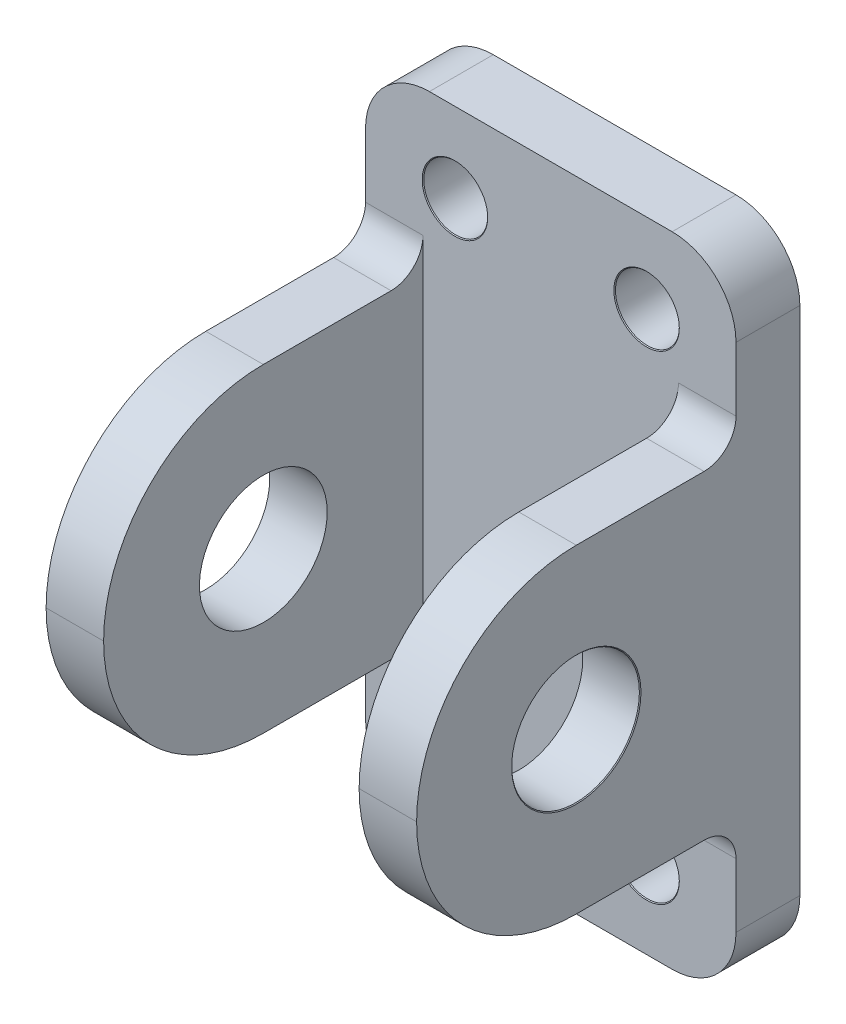
ISO-10303-21;
HEADER;
FILE_DESCRIPTION(('STEP AP214'),'2;1');
FILE_NAME('part.step','',(''),(''),'','','');
FILE_SCHEMA(('AUTOMOTIVE_DESIGN { 1 0 10303 214 1 1 1 1 }'));
ENDSEC;
DATA;
#1=APPLICATION_CONTEXT('core data for automotive mechanical design processes');
#2=APPLICATION_PROTOCOL_DEFINITION('international standard','automotive_design',2000,#1);
#3=PRODUCT_CONTEXT('',#1,'mechanical');
#4=PRODUCT('Part','Part','',(#3));
#5=PRODUCT_RELATED_PRODUCT_CATEGORY('part','',(#4));
#6=PRODUCT_DEFINITION_FORMATION('','',#4);
#7=PRODUCT_DEFINITION_CONTEXT('part definition',#1,'design');
#8=PRODUCT_DEFINITION('design','',#6,#7);
#9=PRODUCT_DEFINITION_SHAPE('','',#8);
#10=(LENGTH_UNIT() NAMED_UNIT(*) SI_UNIT(.MILLI.,.METRE.));
#11=(NAMED_UNIT(*) PLANE_ANGLE_UNIT() SI_UNIT($,.RADIAN.));
#12=(NAMED_UNIT(*) SI_UNIT($,.STERADIAN.) SOLID_ANGLE_UNIT());
#13=UNCERTAINTY_MEASURE_WITH_UNIT(LENGTH_MEASURE(1.E-05),#10,'distance_accuracy_value','');
#14=(GEOMETRIC_REPRESENTATION_CONTEXT(3) GLOBAL_UNCERTAINTY_ASSIGNED_CONTEXT((#13)) GLOBAL_UNIT_ASSIGNED_CONTEXT((#10,
#11,#12)) REPRESENTATION_CONTEXT('',''));
#15=CARTESIAN_POINT('',(0.,0.,0.));
#16=DIRECTION('',(0.,0.,1.));
#17=DIRECTION('',(1.,0.,0.));
#18=AXIS2_PLACEMENT_3D('',#15,#16,#17);
#19=CARTESIAN_POINT('',(0.,0.,0.));
#20=DIRECTION('',(0.,0.,1.));
#21=DIRECTION('',(1.,0.,0.));
#22=AXIS2_PLACEMENT_3D('',#19,#20,#21);
#23=PLANE('',#22);
#24=CARTESIAN_POINT('',(-3.,-7.5,0.));
#25=DIRECTION('',(0.,0.,1.));
#26=DIRECTION('',(1.,0.,0.));
#27=AXIS2_PLACEMENT_3D('',#24,#25,#26);
#28=CIRCLE('',#27,1.025);
#29=CARTESIAN_POINT('',(-1.975,-7.5,0.));
#30=VERTEX_POINT('',#29);
#31=EDGE_CURVE('E416',#30,#30,#28,.T.);
#32=ORIENTED_EDGE('',*,*,#31,.F.);
#33=EDGE_LOOP('',(#32));
#34=FACE_BOUND('',#33,.T.);
#35=CARTESIAN_POINT('',(3.,-7.5,0.));
#36=DIRECTION('',(0.,0.,1.));
#37=DIRECTION('',(1.,0.,0.));
#38=AXIS2_PLACEMENT_3D('',#35,#36,#37);
#39=CIRCLE('',#38,1.025);
#40=CARTESIAN_POINT('',(4.025,-7.5,0.));
#41=VERTEX_POINT('',#40);
#42=EDGE_CURVE('E406',#41,#41,#39,.T.);
#43=ORIENTED_EDGE('',*,*,#42,.F.);
#44=EDGE_LOOP('',(#43));
#45=FACE_BOUND('',#44,.T.);
#46=CARTESIAN_POINT('',(-3.,7.5,0.));
#47=DIRECTION('',(0.,0.,1.));
#48=DIRECTION('',(1.,0.,0.));
#49=AXIS2_PLACEMENT_3D('',#46,#47,#48);
#50=CIRCLE('',#49,1.025);
#51=CARTESIAN_POINT('',(-1.975,7.5,0.));
#52=VERTEX_POINT('',#51);
#53=EDGE_CURVE('E399',#52,#52,#50,.T.);
#54=ORIENTED_EDGE('',*,*,#53,.F.);
#55=EDGE_LOOP('',(#54));
#56=FACE_BOUND('',#55,.T.);
#57=CARTESIAN_POINT('',(3.,7.5,0.));
#58=DIRECTION('',(0.,0.,1.));
#59=DIRECTION('',(1.,0.,0.));
#60=AXIS2_PLACEMENT_3D('',#57,#58,#59);
#61=CIRCLE('',#60,1.025);
#62=CARTESIAN_POINT('',(4.025,7.5,0.));
#63=VERTEX_POINT('',#62);
#64=EDGE_CURVE('E388',#63,#63,#61,.T.);
#65=ORIENTED_EDGE('',*,*,#64,.F.);
#66=EDGE_LOOP('',(#65));
#67=FACE_BOUND('',#66,.T.);
#68=DIRECTION('',(0.,-1.,0.));
#69=VECTOR('',#68,1.);
#70=CARTESIAN_POINT('',(-5.8,-10.,0.));
#71=LINE('',#70,#69);
#72=CARTESIAN_POINT('',(-5.8,8.,0.));
#73=VERTEX_POINT('',#72);
#74=CARTESIAN_POINT('',(-5.8,6.,0.));
#75=VERTEX_POINT('',#74);
#76=EDGE_CURVE('E227',#73,#75,#71,.T.);
#77=ORIENTED_EDGE('',*,*,#76,.T.);
#78=DIRECTION('',(1.,0.,0.));
#79=VECTOR('',#78,1.);
#80=CARTESIAN_POINT('',(-4.,6.,0.));
#81=LINE('',#80,#79);
#82=CARTESIAN_POINT('',(-4.,6.,0.));
#83=VERTEX_POINT('',#82);
#84=EDGE_CURVE('E297',#75,#83,#81,.T.);
#85=ORIENTED_EDGE('',*,*,#84,.T.);
#86=DIRECTION('',(0.,1.,0.));
#87=VECTOR('',#86,1.);
#88=CARTESIAN_POINT('',(-4.,0.,0.));
#89=LINE('',#88,#87);
#90=CARTESIAN_POINT('',(-4.,-6.,0.));
#91=VERTEX_POINT('',#90);
#92=EDGE_CURVE('E328',#91,#83,#89,.T.);
#93=ORIENTED_EDGE('',*,*,#92,.F.);
#94=DIRECTION('',(1.,0.,0.));
#95=VECTOR('',#94,1.);
#96=CARTESIAN_POINT('',(0.,-6.,0.));
#97=LINE('',#96,#95);
#98=CARTESIAN_POINT('',(-5.8,-6.,0.));
#99=VERTEX_POINT('',#98);
#100=EDGE_CURVE('E292',#91,#99,#97,.F.);
#101=ORIENTED_EDGE('',*,*,#100,.T.);
#102=CARTESIAN_POINT('',(-5.8,-8.,0.));
#103=VERTEX_POINT('',#102);
#104=EDGE_CURVE('E332',#99,#103,#71,.T.);
#105=ORIENTED_EDGE('',*,*,#104,.T.);
#106=CARTESIAN_POINT('',(-3.8,-8.,0.));
#107=DIRECTION('',(0.,0.,1.));
#108=DIRECTION('',(1.,0.,0.));
#109=AXIS2_PLACEMENT_3D('',#106,#107,#108);
#110=CIRCLE('',#109,2.);
#111=CARTESIAN_POINT('',(-3.8,-10.,0.));
#112=VERTEX_POINT('',#111);
#113=EDGE_CURVE('E261',#103,#112,#110,.T.);
#114=ORIENTED_EDGE('',*,*,#113,.T.);
#115=DIRECTION('',(1.,0.,0.));
#116=VECTOR('',#115,1.);
#117=CARTESIAN_POINT('',(-5.8,-10.,0.));
#118=LINE('',#117,#116);
#119=CARTESIAN_POINT('',(3.8,-10.,0.));
#120=VERTEX_POINT('',#119);
#121=EDGE_CURVE('E342',#112,#120,#118,.T.);
#122=ORIENTED_EDGE('',*,*,#121,.T.);
#123=CARTESIAN_POINT('',(3.8,-8.,0.));
#124=DIRECTION('',(0.,0.,1.));
#125=DIRECTION('',(1.,0.,0.));
#126=AXIS2_PLACEMENT_3D('',#123,#124,#125);
#127=CIRCLE('',#126,2.);
#128=CARTESIAN_POINT('',(5.8,-8.,0.));
#129=VERTEX_POINT('',#128);
#130=EDGE_CURVE('E267',#120,#129,#127,.T.);
#131=ORIENTED_EDGE('',*,*,#130,.T.);
#132=DIRECTION('',(0.,1.,0.));
#133=VECTOR('',#132,1.);
#134=CARTESIAN_POINT('',(5.8,-10.,0.));
#135=LINE('',#134,#133);
#136=CARTESIAN_POINT('',(5.8,-6.,0.));
#137=VERTEX_POINT('',#136);
#138=EDGE_CURVE('E339',#129,#137,#135,.T.);
#139=ORIENTED_EDGE('',*,*,#138,.T.);
#140=DIRECTION('',(1.,0.,0.));
#141=VECTOR('',#140,1.);
#142=CARTESIAN_POINT('',(0.,-6.,0.));
#143=LINE('',#142,#141);
#144=CARTESIAN_POINT('',(4.,-6.,0.));
#145=VERTEX_POINT('',#144);
#146=EDGE_CURVE('E295',#137,#145,#143,.F.);
#147=ORIENTED_EDGE('',*,*,#146,.T.);
#148=DIRECTION('',(0.,1.,0.));
#149=VECTOR('',#148,1.);
#150=CARTESIAN_POINT('',(4.,0.,0.));
#151=LINE('',#150,#149);
#152=CARTESIAN_POINT('',(4.,6.,0.));
#153=VERTEX_POINT('',#152);
#154=EDGE_CURVE('E212',#145,#153,#151,.T.);
#155=ORIENTED_EDGE('',*,*,#154,.T.);
#156=DIRECTION('',(1.,0.,0.));
#157=VECTOR('',#156,1.);
#158=CARTESIAN_POINT('',(5.8,6.,0.));
#159=LINE('',#158,#157);
#160=CARTESIAN_POINT('',(5.8,6.00000000000001,0.));
#161=VERTEX_POINT('',#160);
#162=EDGE_CURVE('E300',#153,#161,#159,.T.);
#163=ORIENTED_EDGE('',*,*,#162,.T.);
#164=CARTESIAN_POINT('',(5.8,8.,0.));
#165=VERTEX_POINT('',#164);
#166=EDGE_CURVE('E341',#161,#165,#135,.T.);
#167=ORIENTED_EDGE('',*,*,#166,.T.);
#168=CARTESIAN_POINT('',(3.8,8.,0.));
#169=DIRECTION('',(0.,0.,1.));
#170=DIRECTION('',(1.,0.,0.));
#171=AXIS2_PLACEMENT_3D('',#168,#169,#170);
#172=CIRCLE('',#171,2.);
#173=CARTESIAN_POINT('',(3.8,10.,0.));
#174=VERTEX_POINT('',#173);
#175=EDGE_CURVE('E263',#165,#174,#172,.T.);
#176=ORIENTED_EDGE('',*,*,#175,.T.);
#177=DIRECTION('',(-1.,0.,0.));
#178=VECTOR('',#177,1.);
#179=CARTESIAN_POINT('',(-5.8,10.,0.));
#180=LINE('',#179,#178);
#181=CARTESIAN_POINT('',(-3.8,10.,0.));
#182=VERTEX_POINT('',#181);
#183=EDGE_CURVE('E337',#174,#182,#180,.T.);
#184=ORIENTED_EDGE('',*,*,#183,.T.);
#185=CARTESIAN_POINT('',(-3.8,8.,0.));
#186=DIRECTION('',(0.,0.,1.));
#187=DIRECTION('',(1.,0.,0.));
#188=AXIS2_PLACEMENT_3D('',#185,#186,#187);
#189=CIRCLE('',#188,2.);
#190=EDGE_CURVE('E262',#182,#73,#189,.T.);
#191=ORIENTED_EDGE('',*,*,#190,.T.);
#192=EDGE_LOOP('',(#77,#85,#93,#101,#105,#114,#122,#131,#139,#147,#155,#163,#167,#176,#184,#191));
#193=FACE_BOUND('',#192,.T.);
#194=ADVANCED_FACE('F41',(#34,#45,#56,#67,#193),#23,.T.);
#195=CARTESIAN_POINT('',(-5.8,-10.,-2.));
#196=DIRECTION('',(0.,-1.,0.));
#197=DIRECTION('',(0.,0.,-1.));
#198=AXIS2_PLACEMENT_3D('',#195,#196,#197);
#199=PLANE('',#198);
#200=DIRECTION('',(1.,0.,0.));
#201=VECTOR('',#200,1.);
#202=CARTESIAN_POINT('',(-5.8,-10.,-2.));
#203=LINE('',#202,#201);
#204=CARTESIAN_POINT('',(-3.8,-10.,-2.));
#205=VERTEX_POINT('',#204);
#206=CARTESIAN_POINT('',(3.8,-10.,-2.));
#207=VERTEX_POINT('',#206);
#208=EDGE_CURVE('E340',#205,#207,#203,.T.);
#209=ORIENTED_EDGE('',*,*,#208,.T.);
#210=DIRECTION('',(0.,0.,1.));
#211=VECTOR('',#210,1.);
#212=CARTESIAN_POINT('',(3.8,-10.,-2.));
#213=LINE('',#212,#211);
#214=EDGE_CURVE('E260',#207,#120,#213,.T.);
#215=ORIENTED_EDGE('',*,*,#214,.T.);
#216=ORIENTED_EDGE('',*,*,#121,.F.);
#217=DIRECTION('',(0.,0.,1.));
#218=VECTOR('',#217,1.);
#219=CARTESIAN_POINT('',(-3.8,-10.,-2.));
#220=LINE('',#219,#218);
#221=EDGE_CURVE('E246',#112,#205,#220,.F.);
#222=ORIENTED_EDGE('',*,*,#221,.T.);
#223=EDGE_LOOP('',(#209,#215,#216,#222));
#224=FACE_BOUND('',#223,.T.);
#225=ADVANCED_FACE('F425',(#224),#199,.T.);
#226=CARTESIAN_POINT('',(-5.8,-10.,-2.));
#227=DIRECTION('',(-1.,0.,0.));
#228=DIRECTION('',(0.,-1.,0.));
#229=AXIS2_PLACEMENT_3D('',#226,#227,#228);
#230=PLANE('',#229);
#231=CARTESIAN_POINT('',(-5.8,0.,5.));
#232=DIRECTION('',(1.,0.,0.));
#233=DIRECTION('',(0.,0.,-1.));
#234=AXIS2_PLACEMENT_3D('',#231,#232,#233);
#235=CIRCLE('',#234,2.);
#236=CARTESIAN_POINT('',(-5.8,0.,3.));
#237=VERTEX_POINT('',#236);
#238=EDGE_CURVE('E259',#237,#237,#235,.T.);
#239=ORIENTED_EDGE('',*,*,#238,.T.);
#240=EDGE_LOOP('',(#239));
#241=FACE_BOUND('',#240,.T.);
#242=DIRECTION('',(0.,-1.,0.));
#243=VECTOR('',#242,1.);
#244=CARTESIAN_POINT('',(-5.8,-10.,-2.));
#245=LINE('',#244,#243);
#246=CARTESIAN_POINT('',(-5.8,8.,-2.));
#247=VERTEX_POINT('',#246);
#248=CARTESIAN_POINT('',(-5.8,-8.,-2.));
#249=VERTEX_POINT('',#248);
#250=EDGE_CURVE('E216',#247,#249,#245,.T.);
#251=ORIENTED_EDGE('',*,*,#250,.T.);
#252=DIRECTION('',(0.,0.,1.));
#253=VECTOR('',#252,1.);
#254=CARTESIAN_POINT('',(-5.8,-8.,-2.));
#255=LINE('',#254,#253);
#256=EDGE_CURVE('E285',#249,#103,#255,.T.);
#257=ORIENTED_EDGE('',*,*,#256,.T.);
#258=ORIENTED_EDGE('',*,*,#104,.F.);
#259=CARTESIAN_POINT('',(-5.8,-6.,0.999999999999999));
#260=DIRECTION('',(-1.,0.,0.));
#261=DIRECTION('',(0.,-1.,0.));
#262=AXIS2_PLACEMENT_3D('',#259,#260,#261);
#263=CIRCLE('',#262,1.);
#264=CARTESIAN_POINT('',(-5.8,-5.,0.999999999999999));
#265=VERTEX_POINT('',#264);
#266=EDGE_CURVE('E11',#99,#265,#263,.F.);
#267=ORIENTED_EDGE('',*,*,#266,.T.);
#268=DIRECTION('',(0.,0.,-1.));
#269=VECTOR('',#268,1.);
#270=CARTESIAN_POINT('',(-5.8,-5.,10.));
#271=LINE('',#270,#269);
#272=CARTESIAN_POINT('',(-5.8,-5.,5.));
#273=VERTEX_POINT('',#272);
#274=EDGE_CURVE('E369',#273,#265,#271,.T.);
#275=ORIENTED_EDGE('',*,*,#274,.F.);
#276=CARTESIAN_POINT('',(-5.8,0.,5.));
#277=DIRECTION('',(-1.,0.,0.));
#278=DIRECTION('',(0.,-1.,0.));
#279=AXIS2_PLACEMENT_3D('',#276,#277,#278);
#280=CIRCLE('',#279,5.);
#281=CARTESIAN_POINT('',(-5.8,0.,10.));
#282=VERTEX_POINT('',#281);
#283=EDGE_CURVE('E239',#273,#282,#280,.T.);
#284=ORIENTED_EDGE('',*,*,#283,.T.);
#285=CARTESIAN_POINT('',(-5.8,0.,5.));
#286=DIRECTION('',(-1.,0.,0.));
#287=DIRECTION('',(0.,-1.,0.));
#288=AXIS2_PLACEMENT_3D('',#285,#286,#287);
#289=CIRCLE('',#288,5.);
#290=CARTESIAN_POINT('',(-5.8,5.,5.));
#291=VERTEX_POINT('',#290);
#292=EDGE_CURVE('E245',#282,#291,#289,.T.);
#293=ORIENTED_EDGE('',*,*,#292,.T.);
#294=DIRECTION('',(0.,0.,-1.));
#295=VECTOR('',#294,1.);
#296=CARTESIAN_POINT('',(-5.8,5.,10.));
#297=LINE('',#296,#295);
#298=CARTESIAN_POINT('',(-5.8,5.,0.999999999999999));
#299=VERTEX_POINT('',#298);
#300=EDGE_CURVE('E370',#291,#299,#297,.T.);
#301=ORIENTED_EDGE('',*,*,#300,.T.);
#302=CARTESIAN_POINT('',(-5.8,6.,1.));
#303=DIRECTION('',(-1.,0.,0.));
#304=DIRECTION('',(0.,-1.,0.));
#305=AXIS2_PLACEMENT_3D('',#302,#303,#304);
#306=CIRCLE('',#305,1.);
#307=EDGE_CURVE('E312',#299,#75,#306,.F.);
#308=ORIENTED_EDGE('',*,*,#307,.T.);
#309=ORIENTED_EDGE('',*,*,#76,.F.);
#310=DIRECTION('',(0.,0.,1.));
#311=VECTOR('',#310,1.);
#312=CARTESIAN_POINT('',(-5.8,8.,-2.));
#313=LINE('',#312,#311);
#314=EDGE_CURVE('E284',#73,#247,#313,.F.);
#315=ORIENTED_EDGE('',*,*,#314,.T.);
#316=EDGE_LOOP('',(#251,#257,#258,#267,#275,#284,#293,#301,#308,#309,#315));
#317=FACE_BOUND('',#316,.T.);
#318=ADVANCED_FACE('F333',(#241,#317),#230,.T.);
#319=CARTESIAN_POINT('',(-5.8,10.,-2.));
#320=DIRECTION('',(0.,1.,0.));
#321=DIRECTION('',(0.,0.,1.));
#322=AXIS2_PLACEMENT_3D('',#319,#320,#321);
#323=PLANE('',#322);
#324=DIRECTION('',(-1.,0.,0.));
#325=VECTOR('',#324,1.);
#326=CARTESIAN_POINT('',(-5.8,10.,-2.));
#327=LINE('',#326,#325);
#328=CARTESIAN_POINT('',(3.8,10.,-2.));
#329=VERTEX_POINT('',#328);
#330=CARTESIAN_POINT('',(-3.8,10.,-2.));
#331=VERTEX_POINT('',#330);
#332=EDGE_CURVE('E223',#329,#331,#327,.T.);
#333=ORIENTED_EDGE('',*,*,#332,.T.);
#334=DIRECTION('',(0.,0.,1.));
#335=VECTOR('',#334,1.);
#336=CARTESIAN_POINT('',(-3.8,10.,-2.));
#337=LINE('',#336,#335);
#338=EDGE_CURVE('E288',#331,#182,#337,.T.);
#339=ORIENTED_EDGE('',*,*,#338,.T.);
#340=ORIENTED_EDGE('',*,*,#183,.F.);
#341=DIRECTION('',(0.,0.,1.));
#342=VECTOR('',#341,1.);
#343=CARTESIAN_POINT('',(3.8,10.,-2.));
#344=LINE('',#343,#342);
#345=EDGE_CURVE('E287',#174,#329,#344,.F.);
#346=ORIENTED_EDGE('',*,*,#345,.T.);
#347=EDGE_LOOP('',(#333,#339,#340,#346));
#348=FACE_BOUND('',#347,.T.);
#349=ADVANCED_FACE('F486',(#348),#323,.T.);
#350=CARTESIAN_POINT('',(5.8,-10.,-2.));
#351=DIRECTION('',(1.,0.,0.));
#352=DIRECTION('',(0.,1.,0.));
#353=AXIS2_PLACEMENT_3D('',#350,#351,#352);
#354=PLANE('',#353);
#355=CARTESIAN_POINT('',(5.8,0.,5.));
#356=DIRECTION('',(1.,0.,0.));
#357=DIRECTION('',(0.,0.,-1.));
#358=AXIS2_PLACEMENT_3D('',#355,#356,#357);
#359=CIRCLE('',#358,2.025);
#360=CARTESIAN_POINT('',(5.8,0.,2.975));
#361=VERTEX_POINT('',#360);
#362=EDGE_CURVE('E379',#361,#361,#359,.T.);
#363=ORIENTED_EDGE('',*,*,#362,.F.);
#364=EDGE_LOOP('',(#363));
#365=FACE_BOUND('',#364,.T.);
#366=ORIENTED_EDGE('',*,*,#138,.F.);
#367=DIRECTION('',(0.,0.,1.));
#368=VECTOR('',#367,1.);
#369=CARTESIAN_POINT('',(5.8,-8.,-2.));
#370=LINE('',#369,#368);
#371=CARTESIAN_POINT('',(5.8,-8.,-2.));
#372=VERTEX_POINT('',#371);
#373=EDGE_CURVE('E275',#129,#372,#370,.F.);
#374=ORIENTED_EDGE('',*,*,#373,.T.);
#375=DIRECTION('',(0.,1.,0.));
#376=VECTOR('',#375,1.);
#377=CARTESIAN_POINT('',(5.8,-10.,-2.));
#378=LINE('',#377,#376);
#379=CARTESIAN_POINT('',(5.8,8.,-2.));
#380=VERTEX_POINT('',#379);
#381=EDGE_CURVE('E346',#372,#380,#378,.T.);
#382=ORIENTED_EDGE('',*,*,#381,.T.);
#383=DIRECTION('',(0.,0.,1.));
#384=VECTOR('',#383,1.);
#385=CARTESIAN_POINT('',(5.8,8.,-2.));
#386=LINE('',#385,#384);
#387=EDGE_CURVE('E268',#380,#165,#386,.T.);
#388=ORIENTED_EDGE('',*,*,#387,.T.);
#389=ORIENTED_EDGE('',*,*,#166,.F.);
#390=CARTESIAN_POINT('',(5.8,6.,1.));
#391=DIRECTION('',(1.,0.,0.));
#392=DIRECTION('',(0.,1.,0.));
#393=AXIS2_PLACEMENT_3D('',#390,#391,#392);
#394=CIRCLE('',#393,1.);
#395=CARTESIAN_POINT('',(5.79999999999999,5.,0.999999999999999));
#396=VERTEX_POINT('',#395);
#397=EDGE_CURVE('E314',#161,#396,#394,.F.);
#398=ORIENTED_EDGE('',*,*,#397,.T.);
#399=DIRECTION('',(0.,0.,-1.));
#400=VECTOR('',#399,1.);
#401=CARTESIAN_POINT('',(5.79999999999999,5.,10.));
#402=LINE('',#401,#400);
#403=CARTESIAN_POINT('',(5.79999999999999,5.,5.));
#404=VERTEX_POINT('',#403);
#405=EDGE_CURVE('E213',#404,#396,#402,.T.);
#406=ORIENTED_EDGE('',*,*,#405,.F.);
#407=CARTESIAN_POINT('',(5.8,0.,5.));
#408=DIRECTION('',(1.,0.,0.));
#409=DIRECTION('',(0.,1.,0.));
#410=AXIS2_PLACEMENT_3D('',#407,#408,#409);
#411=CIRCLE('',#410,5.);
#412=CARTESIAN_POINT('',(5.79999999999999,0.,10.));
#413=VERTEX_POINT('',#412);
#414=EDGE_CURVE('E217',#404,#413,#411,.T.);
#415=ORIENTED_EDGE('',*,*,#414,.T.);
#416=CARTESIAN_POINT('',(5.8,0.,5.));
#417=DIRECTION('',(1.,0.,0.));
#418=DIRECTION('',(0.,1.,0.));
#419=AXIS2_PLACEMENT_3D('',#416,#417,#418);
#420=CIRCLE('',#419,5.);
#421=CARTESIAN_POINT('',(5.8,-5.,5.));
#422=VERTEX_POINT('',#421);
#423=EDGE_CURVE('E220',#413,#422,#420,.T.);
#424=ORIENTED_EDGE('',*,*,#423,.T.);
#425=DIRECTION('',(0.,0.,-1.));
#426=VECTOR('',#425,1.);
#427=CARTESIAN_POINT('',(5.8,-5.,10.));
#428=LINE('',#427,#426);
#429=CARTESIAN_POINT('',(5.8,-5.,0.999999999999999));
#430=VERTEX_POINT('',#429);
#431=EDGE_CURVE('E356',#422,#430,#428,.T.);
#432=ORIENTED_EDGE('',*,*,#431,.T.);
#433=CARTESIAN_POINT('',(5.8,-6.,0.999999999999999));
#434=DIRECTION('',(1.,0.,0.));
#435=DIRECTION('',(0.,1.,0.));
#436=AXIS2_PLACEMENT_3D('',#433,#434,#435);
#437=CIRCLE('',#436,1.);
#438=EDGE_CURVE('E316',#430,#137,#437,.F.);
#439=ORIENTED_EDGE('',*,*,#438,.T.);
#440=EDGE_LOOP('',(#366,#374,#382,#388,#389,#398,#406,#415,#424,#432,#439));
#441=FACE_BOUND('',#440,.T.);
#442=ADVANCED_FACE('F484',(#365,#441),#354,.T.);
#443=CARTESIAN_POINT('',(0.,0.,-2.));
#444=DIRECTION('',(0.,0.,1.));
#445=DIRECTION('',(1.,0.,0.));
#446=AXIS2_PLACEMENT_3D('',#443,#444,#445);
#447=PLANE('',#446);
#448=CARTESIAN_POINT('',(-3.,-7.5,-2.));
#449=DIRECTION('',(0.,0.,1.));
#450=DIRECTION('',(1.,0.,0.));
#451=AXIS2_PLACEMENT_3D('',#448,#449,#450);
#452=CIRCLE('',#451,1.);
#453=CARTESIAN_POINT('',(-2.,-7.5,-2.));
#454=VERTEX_POINT('',#453);
#455=EDGE_CURVE('E407',#454,#454,#452,.T.);
#456=ORIENTED_EDGE('',*,*,#455,.T.);
#457=EDGE_LOOP('',(#456));
#458=FACE_BOUND('',#457,.T.);
#459=CARTESIAN_POINT('',(3.,-7.5,-2.));
#460=DIRECTION('',(0.,0.,1.));
#461=DIRECTION('',(1.,0.,0.));
#462=AXIS2_PLACEMENT_3D('',#459,#460,#461);
#463=CIRCLE('',#462,1.);
#464=CARTESIAN_POINT('',(4.,-7.5,-2.));
#465=VERTEX_POINT('',#464);
#466=EDGE_CURVE('E402',#465,#465,#463,.T.);
#467=ORIENTED_EDGE('',*,*,#466,.T.);
#468=EDGE_LOOP('',(#467));
#469=FACE_BOUND('',#468,.T.);
#470=CARTESIAN_POINT('',(-3.,7.5,-2.));
#471=DIRECTION('',(0.,0.,1.));
#472=DIRECTION('',(1.,0.,0.));
#473=AXIS2_PLACEMENT_3D('',#470,#471,#472);
#474=CIRCLE('',#473,1.);
#475=CARTESIAN_POINT('',(-2.,7.5,-2.));
#476=VERTEX_POINT('',#475);
#477=EDGE_CURVE('E394',#476,#476,#474,.T.);
#478=ORIENTED_EDGE('',*,*,#477,.T.);
#479=EDGE_LOOP('',(#478));
#480=FACE_BOUND('',#479,.T.);
#481=CARTESIAN_POINT('',(3.,7.5,-2.));
#482=DIRECTION('',(0.,0.,1.));
#483=DIRECTION('',(1.,0.,0.));
#484=AXIS2_PLACEMENT_3D('',#481,#482,#483);
#485=CIRCLE('',#484,1.);
#486=CARTESIAN_POINT('',(4.,7.5,-2.));
#487=VERTEX_POINT('',#486);
#488=EDGE_CURVE('E384',#487,#487,#485,.T.);
#489=ORIENTED_EDGE('',*,*,#488,.T.);
#490=EDGE_LOOP('',(#489));
#491=FACE_BOUND('',#490,.T.);
#492=ORIENTED_EDGE('',*,*,#381,.F.);
#493=CARTESIAN_POINT('',(3.8,-8.,-2.));
#494=DIRECTION('',(0.,0.,1.));
#495=DIRECTION('',(1.,0.,0.));
#496=AXIS2_PLACEMENT_3D('',#493,#494,#495);
#497=CIRCLE('',#496,2.);
#498=EDGE_CURVE('E277',#372,#207,#497,.F.);
#499=ORIENTED_EDGE('',*,*,#498,.T.);
#500=ORIENTED_EDGE('',*,*,#208,.F.);
#501=CARTESIAN_POINT('',(-3.8,-8.,-2.));
#502=DIRECTION('',(0.,0.,1.));
#503=DIRECTION('',(1.,0.,0.));
#504=AXIS2_PLACEMENT_3D('',#501,#502,#503);
#505=CIRCLE('',#504,2.);
#506=EDGE_CURVE('E280',#205,#249,#505,.F.);
#507=ORIENTED_EDGE('',*,*,#506,.T.);
#508=ORIENTED_EDGE('',*,*,#250,.F.);
#509=CARTESIAN_POINT('',(-3.8,8.,-2.));
#510=DIRECTION('',(0.,0.,1.));
#511=DIRECTION('',(1.,0.,0.));
#512=AXIS2_PLACEMENT_3D('',#509,#510,#511);
#513=CIRCLE('',#512,2.);
#514=EDGE_CURVE('E279',#247,#331,#513,.F.);
#515=ORIENTED_EDGE('',*,*,#514,.T.);
#516=ORIENTED_EDGE('',*,*,#332,.F.);
#517=CARTESIAN_POINT('',(3.8,8.,-2.));
#518=DIRECTION('',(0.,0.,1.));
#519=DIRECTION('',(1.,0.,0.));
#520=AXIS2_PLACEMENT_3D('',#517,#518,#519);
#521=CIRCLE('',#520,2.);
#522=EDGE_CURVE('E274',#329,#380,#521,.F.);
#523=ORIENTED_EDGE('',*,*,#522,.T.);
#524=EDGE_LOOP('',(#492,#499,#500,#507,#508,#515,#516,#523));
#525=FACE_BOUND('',#524,.T.);
#526=ADVANCED_FACE('F476',(#458,#469,#480,#491,#525),#447,.F.);
#527=CARTESIAN_POINT('',(4.,0.,10.));
#528=DIRECTION('',(-1.,0.,0.));
#529=DIRECTION('',(0.,-1.,0.));
#530=AXIS2_PLACEMENT_3D('',#527,#528,#529);
#531=PLANE('',#530);
#532=CARTESIAN_POINT('',(4.,0.,5.));
#533=DIRECTION('',(-1.,0.,0.));
#534=DIRECTION('',(0.,-1.,0.));
#535=AXIS2_PLACEMENT_3D('',#532,#533,#534);
#536=CIRCLE('',#535,2.);
#537=CARTESIAN_POINT('',(4.,-1.99999999999999,5.));
#538=VERTEX_POINT('',#537);
#539=EDGE_CURVE('E254',#538,#538,#536,.T.);
#540=ORIENTED_EDGE('',*,*,#539,.F.);
#541=EDGE_LOOP('',(#540));
#542=FACE_BOUND('',#541,.T.);
#543=CARTESIAN_POINT('',(4.,0.,5.));
#544=DIRECTION('',(-1.,0.,0.));
#545=DIRECTION('',(0.,-1.,0.));
#546=AXIS2_PLACEMENT_3D('',#543,#544,#545);
#547=CIRCLE('',#546,5.);
#548=CARTESIAN_POINT('',(4.,-5.,5.));
#549=VERTEX_POINT('',#548);
#550=CARTESIAN_POINT('',(4.,0.,10.));
#551=VERTEX_POINT('',#550);
#552=EDGE_CURVE('E200',#549,#551,#547,.T.);
#553=ORIENTED_EDGE('',*,*,#552,.T.);
#554=CARTESIAN_POINT('',(4.,0.,5.));
#555=DIRECTION('',(-1.,0.,0.));
#556=DIRECTION('',(0.,-1.,0.));
#557=AXIS2_PLACEMENT_3D('',#554,#555,#556);
#558=CIRCLE('',#557,5.);
#559=CARTESIAN_POINT('',(4.,5.,5.));
#560=VERTEX_POINT('',#559);
#561=EDGE_CURVE('E194',#551,#560,#558,.T.);
#562=ORIENTED_EDGE('',*,*,#561,.T.);
#563=DIRECTION('',(0.,0.,-1.));
#564=VECTOR('',#563,1.);
#565=CARTESIAN_POINT('',(4.,5.,10.));
#566=LINE('',#565,#564);
#567=CARTESIAN_POINT('',(4.,5.,0.999999999999999));
#568=VERTEX_POINT('',#567);
#569=EDGE_CURVE('E192',#560,#568,#566,.T.);
#570=ORIENTED_EDGE('',*,*,#569,.T.);
#571=CARTESIAN_POINT('',(4.,6.,1.));
#572=DIRECTION('',(-1.,0.,0.));
#573=DIRECTION('',(0.,-1.,0.));
#574=AXIS2_PLACEMENT_3D('',#571,#572,#573);
#575=CIRCLE('',#574,1.);
#576=EDGE_CURVE('E320',#568,#153,#575,.F.);
#577=ORIENTED_EDGE('',*,*,#576,.T.);
#578=ORIENTED_EDGE('',*,*,#154,.F.);
#579=CARTESIAN_POINT('',(4.,-6.,0.999999999999999));
#580=DIRECTION('',(-1.,0.,0.));
#581=DIRECTION('',(0.,-1.,0.));
#582=AXIS2_PLACEMENT_3D('',#579,#580,#581);
#583=CIRCLE('',#582,1.);
#584=CARTESIAN_POINT('',(4.,-5.,0.999999999999999));
#585=VERTEX_POINT('',#584);
#586=EDGE_CURVE('E324',#145,#585,#583,.F.);
#587=ORIENTED_EDGE('',*,*,#586,.T.);
#588=DIRECTION('',(0.,0.,-1.));
#589=VECTOR('',#588,1.);
#590=CARTESIAN_POINT('',(4.,-5.,10.));
#591=LINE('',#590,#589);
#592=EDGE_CURVE('E355',#549,#585,#591,.T.);
#593=ORIENTED_EDGE('',*,*,#592,.F.);
#594=EDGE_LOOP('',(#553,#562,#570,#577,#578,#587,#593));
#595=FACE_BOUND('',#594,.T.);
#596=ADVANCED_FACE('F195',(#542,#595),#531,.T.);
#597=CARTESIAN_POINT('',(0.,-5.,10.));
#598=DIRECTION('',(0.,1.,0.));
#599=DIRECTION('',(-1.,0.,0.));
#600=AXIS2_PLACEMENT_3D('',#597,#598,#599);
#601=PLANE('',#600);
#602=ORIENTED_EDGE('',*,*,#592,.T.);
#603=DIRECTION('',(1.,0.,0.));
#604=VECTOR('',#603,1.);
#605=CARTESIAN_POINT('',(0.,-5.,0.999999999999999));
#606=LINE('',#605,#604);
#607=EDGE_CURVE('E306',#585,#430,#606,.T.);
#608=ORIENTED_EDGE('',*,*,#607,.T.);
#609=ORIENTED_EDGE('',*,*,#431,.F.);
#610=DIRECTION('',(1.,0.,0.));
#611=VECTOR('',#610,1.);
#612=CARTESIAN_POINT('',(4.,-5.,5.));
#613=LINE('',#612,#611);
#614=EDGE_CURVE('E203',#422,#549,#613,.F.);
#615=ORIENTED_EDGE('',*,*,#614,.T.);
#616=EDGE_LOOP('',(#602,#608,#609,#615));
#617=FACE_BOUND('',#616,.T.);
#618=ADVANCED_FACE('F473',(#617),#601,.F.);
#619=CARTESIAN_POINT('',(0.,5.,10.));
#620=DIRECTION('',(0.,1.,0.));
#621=DIRECTION('',(-1.,0.,0.));
#622=AXIS2_PLACEMENT_3D('',#619,#620,#621);
#623=PLANE('',#622);
#624=ORIENTED_EDGE('',*,*,#405,.T.);
#625=DIRECTION('',(1.,0.,0.));
#626=VECTOR('',#625,1.);
#627=CARTESIAN_POINT('',(4.,5.,1.));
#628=LINE('',#627,#626);
#629=EDGE_CURVE('E215',#396,#568,#628,.F.);
#630=ORIENTED_EDGE('',*,*,#629,.T.);
#631=ORIENTED_EDGE('',*,*,#569,.F.);
#632=DIRECTION('',(1.,0.,0.));
#633=VECTOR('',#632,1.);
#634=CARTESIAN_POINT('',(0.,5.,5.));
#635=LINE('',#634,#633);
#636=EDGE_CURVE('E208',#560,#404,#635,.T.);
#637=ORIENTED_EDGE('',*,*,#636,.T.);
#638=EDGE_LOOP('',(#624,#630,#631,#637));
#639=FACE_BOUND('',#638,.T.);
#640=ADVANCED_FACE('F209',(#639),#623,.T.);
#641=CARTESIAN_POINT('',(0.,-5.,10.));
#642=DIRECTION('',(0.,1.,0.));
#643=DIRECTION('',(-1.,0.,0.));
#644=AXIS2_PLACEMENT_3D('',#641,#642,#643);
#645=PLANE('',#644);
#646=ORIENTED_EDGE('',*,*,#274,.T.);
#647=DIRECTION('',(1.,0.,0.));
#648=VECTOR('',#647,1.);
#649=CARTESIAN_POINT('',(0.,-5.,0.999999999999999));
#650=LINE('',#649,#648);
#651=CARTESIAN_POINT('',(-4.,-5.,0.999999999999999));
#652=VERTEX_POINT('',#651);
#653=EDGE_CURVE('E307',#265,#652,#650,.T.);
#654=ORIENTED_EDGE('',*,*,#653,.T.);
#655=DIRECTION('',(0.,0.,-1.));
#656=VECTOR('',#655,1.);
#657=CARTESIAN_POINT('',(-4.,-5.,10.));
#658=LINE('',#657,#656);
#659=CARTESIAN_POINT('',(-4.,-5.,5.));
#660=VERTEX_POINT('',#659);
#661=EDGE_CURVE('E330',#660,#652,#658,.T.);
#662=ORIENTED_EDGE('',*,*,#661,.F.);
#663=DIRECTION('',(1.,0.,0.));
#664=VECTOR('',#663,1.);
#665=CARTESIAN_POINT('',(-5.8,-5.,5.));
#666=LINE('',#665,#664);
#667=EDGE_CURVE('E242',#660,#273,#666,.F.);
#668=ORIENTED_EDGE('',*,*,#667,.T.);
#669=EDGE_LOOP('',(#646,#654,#662,#668));
#670=FACE_BOUND('',#669,.T.);
#671=ADVANCED_FACE('F470',(#670),#645,.F.);
#672=CARTESIAN_POINT('',(-4.,0.,10.));
#673=DIRECTION('',(-1.,0.,0.));
#674=DIRECTION('',(0.,-1.,0.));
#675=AXIS2_PLACEMENT_3D('',#672,#673,#674);
#676=PLANE('',#675);
#677=CARTESIAN_POINT('',(-4.,0.,5.));
#678=DIRECTION('',(-1.,0.,0.));
#679=DIRECTION('',(0.,-1.,0.));
#680=AXIS2_PLACEMENT_3D('',#677,#678,#679);
#681=CIRCLE('',#680,2.);
#682=CARTESIAN_POINT('',(-4.,-1.99999999999999,5.));
#683=VERTEX_POINT('',#682);
#684=EDGE_CURVE('E255',#683,#683,#681,.T.);
#685=ORIENTED_EDGE('',*,*,#684,.T.);
#686=EDGE_LOOP('',(#685));
#687=FACE_BOUND('',#686,.T.);
#688=DIRECTION('',(0.,0.,-1.));
#689=VECTOR('',#688,1.);
#690=CARTESIAN_POINT('',(-4.,5.,10.));
#691=LINE('',#690,#689);
#692=CARTESIAN_POINT('',(-4.,5.,5.));
#693=VERTEX_POINT('',#692);
#694=CARTESIAN_POINT('',(-4.,5.,0.999999999999999));
#695=VERTEX_POINT('',#694);
#696=EDGE_CURVE('E364',#693,#695,#691,.T.);
#697=ORIENTED_EDGE('',*,*,#696,.F.);
#698=CARTESIAN_POINT('',(-4.,0.,5.));
#699=DIRECTION('',(-1.,0.,0.));
#700=DIRECTION('',(0.,-1.,0.));
#701=AXIS2_PLACEMENT_3D('',#698,#699,#700);
#702=CIRCLE('',#701,5.);
#703=CARTESIAN_POINT('',(-4.,0.,10.));
#704=VERTEX_POINT('',#703);
#705=EDGE_CURVE('E238',#693,#704,#702,.F.);
#706=ORIENTED_EDGE('',*,*,#705,.T.);
#707=CARTESIAN_POINT('',(-4.,0.,5.));
#708=DIRECTION('',(-1.,0.,0.));
#709=DIRECTION('',(0.,-1.,0.));
#710=AXIS2_PLACEMENT_3D('',#707,#708,#709);
#711=CIRCLE('',#710,5.);
#712=EDGE_CURVE('E236',#704,#660,#711,.F.);
#713=ORIENTED_EDGE('',*,*,#712,.T.);
#714=ORIENTED_EDGE('',*,*,#661,.T.);
#715=CARTESIAN_POINT('',(-4.,-6.,0.999999999999999));
#716=DIRECTION('',(-1.,0.,0.));
#717=DIRECTION('',(0.,-1.,0.));
#718=AXIS2_PLACEMENT_3D('',#715,#716,#717);
#719=CIRCLE('',#718,1.);
#720=EDGE_CURVE('E47',#652,#91,#719,.T.);
#721=ORIENTED_EDGE('',*,*,#720,.T.);
#722=ORIENTED_EDGE('',*,*,#92,.T.);
#723=CARTESIAN_POINT('',(-4.,6.,1.));
#724=DIRECTION('',(-1.,0.,0.));
#725=DIRECTION('',(0.,-1.,0.));
#726=AXIS2_PLACEMENT_3D('',#723,#724,#725);
#727=CIRCLE('',#726,1.);
#728=EDGE_CURVE('E311',#83,#695,#727,.T.);
#729=ORIENTED_EDGE('',*,*,#728,.T.);
#730=EDGE_LOOP('',(#697,#706,#713,#714,#721,#722,#729));
#731=FACE_BOUND('',#730,.T.);
#732=ADVANCED_FACE('F322',(#687,#731),#676,.F.);
#733=CARTESIAN_POINT('',(0.,5.,10.));
#734=DIRECTION('',(0.,1.,0.));
#735=DIRECTION('',(-1.,0.,0.));
#736=AXIS2_PLACEMENT_3D('',#733,#734,#735);
#737=PLANE('',#736);
#738=ORIENTED_EDGE('',*,*,#696,.T.);
#739=DIRECTION('',(1.,0.,0.));
#740=VECTOR('',#739,1.);
#741=CARTESIAN_POINT('',(-5.8,5.,1.));
#742=LINE('',#741,#740);
#743=EDGE_CURVE('E303',#695,#299,#742,.F.);
#744=ORIENTED_EDGE('',*,*,#743,.T.);
#745=ORIENTED_EDGE('',*,*,#300,.F.);
#746=DIRECTION('',(1.,0.,0.));
#747=VECTOR('',#746,1.);
#748=CARTESIAN_POINT('',(0.,5.,5.));
#749=LINE('',#748,#747);
#750=EDGE_CURVE('E231',#291,#693,#749,.T.);
#751=ORIENTED_EDGE('',*,*,#750,.T.);
#752=EDGE_LOOP('',(#738,#744,#745,#751));
#753=FACE_BOUND('',#752,.T.);
#754=ADVANCED_FACE('F456',(#753),#737,.T.);
#755=CARTESIAN_POINT('',(0.,0.,5.));
#756=DIRECTION('',(-1.,0.,0.));
#757=DIRECTION('',(0.,-1.,0.));
#758=AXIS2_PLACEMENT_3D('',#755,#756,#757);
#759=CYLINDRICAL_SURFACE('',#758,5.);
#760=DIRECTION('',(1.,0.,0.));
#761=VECTOR('',#760,1.);
#762=CARTESIAN_POINT('',(5.8,0.,10.));
#763=LINE('',#762,#761);
#764=EDGE_CURVE('E250',#551,#413,#763,.T.);
#765=ORIENTED_EDGE('',*,*,#764,.F.);
#766=ORIENTED_EDGE('',*,*,#552,.F.);
#767=ORIENTED_EDGE('',*,*,#614,.F.);
#768=ORIENTED_EDGE('',*,*,#423,.F.);
#769=EDGE_LOOP('',(#765,#766,#767,#768));
#770=FACE_BOUND('',#769,.T.);
#771=ADVANCED_FACE('F464',(#770),#759,.T.);
#772=CARTESIAN_POINT('',(0.,0.,5.));
#773=DIRECTION('',(1.,0.,0.));
#774=DIRECTION('',(0.,1.,0.));
#775=AXIS2_PLACEMENT_3D('',#772,#773,#774);
#776=CYLINDRICAL_SURFACE('',#775,5.);
#777=ORIENTED_EDGE('',*,*,#561,.F.);
#778=ORIENTED_EDGE('',*,*,#764,.T.);
#779=ORIENTED_EDGE('',*,*,#414,.F.);
#780=ORIENTED_EDGE('',*,*,#636,.F.);
#781=EDGE_LOOP('',(#777,#778,#779,#780));
#782=FACE_BOUND('',#781,.T.);
#783=ADVANCED_FACE('F219',(#782),#776,.T.);
#784=CARTESIAN_POINT('',(0.,0.,5.));
#785=DIRECTION('',(-1.,0.,0.));
#786=DIRECTION('',(0.,-1.,0.));
#787=AXIS2_PLACEMENT_3D('',#784,#785,#786);
#788=CYLINDRICAL_SURFACE('',#787,5.);
#789=DIRECTION('',(1.,0.,0.));
#790=VECTOR('',#789,1.);
#791=CARTESIAN_POINT('',(-4.,0.,10.));
#792=LINE('',#791,#790);
#793=EDGE_CURVE('E248',#282,#704,#792,.T.);
#794=ORIENTED_EDGE('',*,*,#793,.F.);
#795=ORIENTED_EDGE('',*,*,#283,.F.);
#796=ORIENTED_EDGE('',*,*,#667,.F.);
#797=ORIENTED_EDGE('',*,*,#712,.F.);
#798=EDGE_LOOP('',(#794,#795,#796,#797));
#799=FACE_BOUND('',#798,.T.);
#800=ADVANCED_FACE('F501',(#799),#788,.T.);
#801=CARTESIAN_POINT('',(0.,0.,5.));
#802=DIRECTION('',(1.,0.,0.));
#803=DIRECTION('',(0.,1.,0.));
#804=AXIS2_PLACEMENT_3D('',#801,#802,#803);
#805=CYLINDRICAL_SURFACE('',#804,5.);
#806=ORIENTED_EDGE('',*,*,#292,.F.);
#807=ORIENTED_EDGE('',*,*,#793,.T.);
#808=ORIENTED_EDGE('',*,*,#705,.F.);
#809=ORIENTED_EDGE('',*,*,#750,.F.);
#810=EDGE_LOOP('',(#806,#807,#808,#809));
#811=FACE_BOUND('',#810,.T.);
#812=ADVANCED_FACE('F452',(#811),#805,.T.);
#813=CARTESIAN_POINT('',(5.8,0.,5.));
#814=DIRECTION('',(1.,0.,0.));
#815=DIRECTION('',(0.,0.,-1.));
#816=AXIS2_PLACEMENT_3D('',#813,#814,#815);
#817=CONICAL_SURFACE('',#816,2.025,0.785398163397405);
#818=CARTESIAN_POINT('',(5.775,0.,5.));
#819=DIRECTION('',(1.,0.,0.));
#820=DIRECTION('',(0.,0.,-1.));
#821=AXIS2_PLACEMENT_3D('',#818,#819,#820);
#822=CIRCLE('',#821,2.);
#823=CARTESIAN_POINT('',(5.775,0.,3.));
#824=VERTEX_POINT('',#823);
#825=EDGE_CURVE('E380',#824,#824,#822,.T.);
#826=ORIENTED_EDGE('',*,*,#825,.F.);
#827=EDGE_LOOP('',(#826));
#828=FACE_BOUND('',#827,.T.);
#829=ORIENTED_EDGE('',*,*,#362,.T.);
#830=EDGE_LOOP('',(#829));
#831=FACE_BOUND('',#830,.T.);
#832=ADVANCED_FACE('F454',(#828,#831),#817,.F.);
#833=CARTESIAN_POINT('',(5.8,0.,5.));
#834=DIRECTION('',(1.,0.,0.));
#835=DIRECTION('',(0.,0.,-1.));
#836=AXIS2_PLACEMENT_3D('',#833,#834,#835);
#837=CYLINDRICAL_SURFACE('',#836,2.);
#838=ORIENTED_EDGE('',*,*,#539,.T.);
#839=EDGE_LOOP('',(#838));
#840=FACE_BOUND('',#839,.T.);
#841=ORIENTED_EDGE('',*,*,#825,.T.);
#842=EDGE_LOOP('',(#841));
#843=FACE_BOUND('',#842,.T.);
#844=ADVANCED_FACE('F453',(#840,#843),#837,.F.);
#845=ORIENTED_EDGE('',*,*,#238,.F.);
#846=EDGE_LOOP('',(#845));
#847=FACE_BOUND('',#846,.T.);
#848=ORIENTED_EDGE('',*,*,#684,.F.);
#849=EDGE_LOOP('',(#848));
#850=FACE_BOUND('',#849,.T.);
#851=ADVANCED_FACE('F444',(#847,#850),#837,.F.);
#852=CARTESIAN_POINT('',(3.,7.5,0.));
#853=DIRECTION('',(0.,0.,1.));
#854=DIRECTION('',(1.,0.,0.));
#855=AXIS2_PLACEMENT_3D('',#852,#853,#854);
#856=CYLINDRICAL_SURFACE('',#855,1.);
#857=ORIENTED_EDGE('',*,*,#488,.F.);
#858=EDGE_LOOP('',(#857));
#859=FACE_BOUND('',#858,.T.);
#860=CARTESIAN_POINT('',(3.,7.5,-0.024999999999999));
#861=DIRECTION('',(0.,0.,1.));
#862=DIRECTION('',(1.,0.,0.));
#863=AXIS2_PLACEMENT_3D('',#860,#861,#862);
#864=CIRCLE('',#863,1.);
#865=CARTESIAN_POINT('',(4.,7.5,-0.024999999999999));
#866=VERTEX_POINT('',#865);
#867=EDGE_CURVE('E389',#866,#866,#864,.T.);
#868=ORIENTED_EDGE('',*,*,#867,.T.);
#869=EDGE_LOOP('',(#868));
#870=FACE_BOUND('',#869,.T.);
#871=ADVANCED_FACE('F434',(#859,#870),#856,.F.);
#872=CARTESIAN_POINT('',(3.,7.5,0.));
#873=DIRECTION('',(0.,0.,1.));
#874=DIRECTION('',(1.,0.,0.));
#875=AXIS2_PLACEMENT_3D('',#872,#873,#874);
#876=CONICAL_SURFACE('',#875,1.025,0.785398163397448);
#877=ORIENTED_EDGE('',*,*,#867,.F.);
#878=EDGE_LOOP('',(#877));
#879=FACE_BOUND('',#878,.T.);
#880=ORIENTED_EDGE('',*,*,#64,.T.);
#881=EDGE_LOOP('',(#880));
#882=FACE_BOUND('',#881,.T.);
#883=ADVANCED_FACE('F435',(#879,#882),#876,.F.);
#884=CARTESIAN_POINT('',(-3.,7.5,0.));
#885=DIRECTION('',(0.,0.,1.));
#886=DIRECTION('',(1.,0.,0.));
#887=AXIS2_PLACEMENT_3D('',#884,#885,#886);
#888=CYLINDRICAL_SURFACE('',#887,1.);
#889=ORIENTED_EDGE('',*,*,#477,.F.);
#890=EDGE_LOOP('',(#889));
#891=FACE_BOUND('',#890,.T.);
#892=CARTESIAN_POINT('',(-3.,7.5,-0.024999999999999));
#893=DIRECTION('',(0.,0.,1.));
#894=DIRECTION('',(1.,0.,0.));
#895=AXIS2_PLACEMENT_3D('',#892,#893,#894);
#896=CIRCLE('',#895,1.);
#897=CARTESIAN_POINT('',(-2.,7.5,-0.024999999999999));
#898=VERTEX_POINT('',#897);
#899=EDGE_CURVE('E391',#898,#898,#896,.T.);
#900=ORIENTED_EDGE('',*,*,#899,.T.);
#901=EDGE_LOOP('',(#900));
#902=FACE_BOUND('',#901,.T.);
#903=ADVANCED_FACE('F432',(#891,#902),#888,.F.);
#904=CARTESIAN_POINT('',(-3.,7.5,0.));
#905=DIRECTION('',(0.,0.,1.));
#906=DIRECTION('',(1.,0.,0.));
#907=AXIS2_PLACEMENT_3D('',#904,#905,#906);
#908=CONICAL_SURFACE('',#907,1.025,0.785398163397448);
#909=ORIENTED_EDGE('',*,*,#899,.F.);
#910=EDGE_LOOP('',(#909));
#911=FACE_BOUND('',#910,.T.);
#912=ORIENTED_EDGE('',*,*,#53,.T.);
#913=EDGE_LOOP('',(#912));
#914=FACE_BOUND('',#913,.T.);
#915=ADVANCED_FACE('F445',(#911,#914),#908,.F.);
#916=CARTESIAN_POINT('',(3.,-7.5,0.));
#917=DIRECTION('',(0.,0.,1.));
#918=DIRECTION('',(1.,0.,0.));
#919=AXIS2_PLACEMENT_3D('',#916,#917,#918);
#920=CYLINDRICAL_SURFACE('',#919,1.);
#921=ORIENTED_EDGE('',*,*,#466,.F.);
#922=EDGE_LOOP('',(#921));
#923=FACE_BOUND('',#922,.T.);
#924=CARTESIAN_POINT('',(3.,-7.5,-0.024999999999999));
#925=DIRECTION('',(0.,0.,1.));
#926=DIRECTION('',(1.,0.,0.));
#927=AXIS2_PLACEMENT_3D('',#924,#925,#926);
#928=CIRCLE('',#927,1.);
#929=CARTESIAN_POINT('',(4.,-7.5,-0.024999999999999));
#930=VERTEX_POINT('',#929);
#931=EDGE_CURVE('E404',#930,#930,#928,.T.);
#932=ORIENTED_EDGE('',*,*,#931,.T.);
#933=EDGE_LOOP('',(#932));
#934=FACE_BOUND('',#933,.T.);
#935=ADVANCED_FACE('F653',(#923,#934),#920,.F.);
#936=CARTESIAN_POINT('',(3.,-7.5,0.));
#937=DIRECTION('',(0.,0.,1.));
#938=DIRECTION('',(1.,0.,0.));
#939=AXIS2_PLACEMENT_3D('',#936,#937,#938);
#940=CONICAL_SURFACE('',#939,1.025,0.785398163397448);
#941=ORIENTED_EDGE('',*,*,#931,.F.);
#942=EDGE_LOOP('',(#941));
#943=FACE_BOUND('',#942,.T.);
#944=ORIENTED_EDGE('',*,*,#42,.T.);
#945=EDGE_LOOP('',(#944));
#946=FACE_BOUND('',#945,.T.);
#947=ADVANCED_FACE('F642',(#943,#946),#940,.F.);
#948=CARTESIAN_POINT('',(-3.,-7.5,0.));
#949=DIRECTION('',(0.,0.,1.));
#950=DIRECTION('',(1.,0.,0.));
#951=AXIS2_PLACEMENT_3D('',#948,#949,#950);
#952=CYLINDRICAL_SURFACE('',#951,1.);
#953=ORIENTED_EDGE('',*,*,#455,.F.);
#954=EDGE_LOOP('',(#953));
#955=FACE_BOUND('',#954,.T.);
#956=CARTESIAN_POINT('',(-3.,-7.5,-0.024999999999999));
#957=DIRECTION('',(0.,0.,1.));
#958=DIRECTION('',(1.,0.,0.));
#959=AXIS2_PLACEMENT_3D('',#956,#957,#958);
#960=CIRCLE('',#959,1.);
#961=CARTESIAN_POINT('',(-2.,-7.5,-0.024999999999999));
#962=VERTEX_POINT('',#961);
#963=EDGE_CURVE('E412',#962,#962,#960,.T.);
#964=ORIENTED_EDGE('',*,*,#963,.T.);
#965=EDGE_LOOP('',(#964));
#966=FACE_BOUND('',#965,.T.);
#967=ADVANCED_FACE('F631',(#955,#966),#952,.F.);
#968=CARTESIAN_POINT('',(-3.,-7.5,0.));
#969=DIRECTION('',(0.,0.,1.));
#970=DIRECTION('',(1.,0.,0.));
#971=AXIS2_PLACEMENT_3D('',#968,#969,#970);
#972=CONICAL_SURFACE('',#971,1.025,0.785398163397448);
#973=ORIENTED_EDGE('',*,*,#963,.F.);
#974=EDGE_LOOP('',(#973));
#975=FACE_BOUND('',#974,.T.);
#976=ORIENTED_EDGE('',*,*,#31,.T.);
#977=EDGE_LOOP('',(#976));
#978=FACE_BOUND('',#977,.T.);
#979=ADVANCED_FACE('F420',(#975,#978),#972,.F.);
#980=CARTESIAN_POINT('',(3.8,-8.,-2.));
#981=DIRECTION('',(0.,0.,1.));
#982=DIRECTION('',(1.,0.,0.));
#983=AXIS2_PLACEMENT_3D('',#980,#981,#982);
#984=CYLINDRICAL_SURFACE('',#983,2.);
#985=ORIENTED_EDGE('',*,*,#498,.F.);
#986=ORIENTED_EDGE('',*,*,#373,.F.);
#987=ORIENTED_EDGE('',*,*,#130,.F.);
#988=ORIENTED_EDGE('',*,*,#214,.F.);
#989=EDGE_LOOP('',(#985,#986,#987,#988));
#990=FACE_BOUND('',#989,.T.);
#991=ADVANCED_FACE('F512',(#990),#984,.T.);
#992=CARTESIAN_POINT('',(-3.8,-8.,-2.));
#993=DIRECTION('',(0.,0.,1.));
#994=DIRECTION('',(1.,0.,0.));
#995=AXIS2_PLACEMENT_3D('',#992,#993,#994);
#996=CYLINDRICAL_SURFACE('',#995,2.);
#997=ORIENTED_EDGE('',*,*,#506,.F.);
#998=ORIENTED_EDGE('',*,*,#221,.F.);
#999=ORIENTED_EDGE('',*,*,#113,.F.);
#1000=ORIENTED_EDGE('',*,*,#256,.F.);
#1001=EDGE_LOOP('',(#997,#998,#999,#1000));
#1002=FACE_BOUND('',#1001,.T.);
#1003=ADVANCED_FACE('F511',(#1002),#996,.T.);
#1004=CARTESIAN_POINT('',(-3.8,8.,-2.));
#1005=DIRECTION('',(0.,0.,1.));
#1006=DIRECTION('',(1.,0.,0.));
#1007=AXIS2_PLACEMENT_3D('',#1004,#1005,#1006);
#1008=CYLINDRICAL_SURFACE('',#1007,2.);
#1009=ORIENTED_EDGE('',*,*,#514,.F.);
#1010=ORIENTED_EDGE('',*,*,#314,.F.);
#1011=ORIENTED_EDGE('',*,*,#190,.F.);
#1012=ORIENTED_EDGE('',*,*,#338,.F.);
#1013=EDGE_LOOP('',(#1009,#1010,#1011,#1012));
#1014=FACE_BOUND('',#1013,.T.);
#1015=ADVANCED_FACE('F520',(#1014),#1008,.T.);
#1016=CARTESIAN_POINT('',(3.8,8.,-2.));
#1017=DIRECTION('',(0.,0.,1.));
#1018=DIRECTION('',(1.,0.,0.));
#1019=AXIS2_PLACEMENT_3D('',#1016,#1017,#1018);
#1020=CYLINDRICAL_SURFACE('',#1019,2.);
#1021=ORIENTED_EDGE('',*,*,#522,.F.);
#1022=ORIENTED_EDGE('',*,*,#345,.F.);
#1023=ORIENTED_EDGE('',*,*,#175,.F.);
#1024=ORIENTED_EDGE('',*,*,#387,.F.);
#1025=EDGE_LOOP('',(#1021,#1022,#1023,#1024));
#1026=FACE_BOUND('',#1025,.T.);
#1027=ADVANCED_FACE('F524',(#1026),#1020,.T.);
#1028=CARTESIAN_POINT('',(0.,6.,1.));
#1029=DIRECTION('',(-1.,0.,0.));
#1030=DIRECTION('',(0.,-1.,0.));
#1031=AXIS2_PLACEMENT_3D('',#1028,#1029,#1030);
#1032=CYLINDRICAL_SURFACE('',#1031,1.);
#1033=ORIENTED_EDGE('',*,*,#307,.F.);
#1034=ORIENTED_EDGE('',*,*,#743,.F.);
#1035=ORIENTED_EDGE('',*,*,#728,.F.);
#1036=ORIENTED_EDGE('',*,*,#84,.F.);
#1037=EDGE_LOOP('',(#1033,#1034,#1035,#1036));
#1038=FACE_BOUND('',#1037,.T.);
#1039=ADVANCED_FACE('F526',(#1038),#1032,.F.);
#1040=CARTESIAN_POINT('',(0.,6.,1.));
#1041=DIRECTION('',(-1.,0.,0.));
#1042=DIRECTION('',(0.,-1.,0.));
#1043=AXIS2_PLACEMENT_3D('',#1040,#1041,#1042);
#1044=CYLINDRICAL_SURFACE('',#1043,1.);
#1045=ORIENTED_EDGE('',*,*,#576,.F.);
#1046=ORIENTED_EDGE('',*,*,#629,.F.);
#1047=ORIENTED_EDGE('',*,*,#397,.F.);
#1048=ORIENTED_EDGE('',*,*,#162,.F.);
#1049=EDGE_LOOP('',(#1045,#1046,#1047,#1048));
#1050=FACE_BOUND('',#1049,.T.);
#1051=ADVANCED_FACE('F530',(#1050),#1044,.F.);
#1052=CARTESIAN_POINT('',(0.,-6.,0.999999999999999));
#1053=DIRECTION('',(1.,0.,0.));
#1054=DIRECTION('',(0.,1.,0.));
#1055=AXIS2_PLACEMENT_3D('',#1052,#1053,#1054);
#1056=CYLINDRICAL_SURFACE('',#1055,1.);
#1057=ORIENTED_EDGE('',*,*,#586,.F.);
#1058=ORIENTED_EDGE('',*,*,#146,.F.);
#1059=ORIENTED_EDGE('',*,*,#438,.F.);
#1060=ORIENTED_EDGE('',*,*,#607,.F.);
#1061=EDGE_LOOP('',(#1057,#1058,#1059,#1060));
#1062=FACE_BOUND('',#1061,.T.);
#1063=ADVANCED_FACE('F531',(#1062),#1056,.F.);
#1064=CARTESIAN_POINT('',(0.,-6.,0.999999999999999));
#1065=DIRECTION('',(1.,0.,0.));
#1066=DIRECTION('',(0.,1.,0.));
#1067=AXIS2_PLACEMENT_3D('',#1064,#1065,#1066);
#1068=CYLINDRICAL_SURFACE('',#1067,1.);
#1069=ORIENTED_EDGE('',*,*,#266,.F.);
#1070=ORIENTED_EDGE('',*,*,#100,.F.);
#1071=ORIENTED_EDGE('',*,*,#720,.F.);
#1072=ORIENTED_EDGE('',*,*,#653,.F.);
#1073=EDGE_LOOP('',(#1069,#1070,#1071,#1072));
#1074=FACE_BOUND('',#1073,.T.);
#1075=ADVANCED_FACE('F43',(#1074),#1068,.F.);
#1076=CLOSED_SHELL('',(#194,#225,#318,#349,#442,#526,#596,#618,#640,#671,#732,#754,#771,#783,
#800,#812,#832,#844,#851,#871,#883,#903,#915,#935,#947,#967,#979,#991,#1003,#1015,#1027,#1039,
#1051,#1063,#1075));
#1077=MANIFOLD_SOLID_BREP('B2',#1076);
#1078=ADVANCED_BREP_SHAPE_REPRESENTATION('',(#18,#1077),#14);
#1079=SHAPE_DEFINITION_REPRESENTATION(#9,#1078);
ENDSEC;
END-ISO-10303-21;
